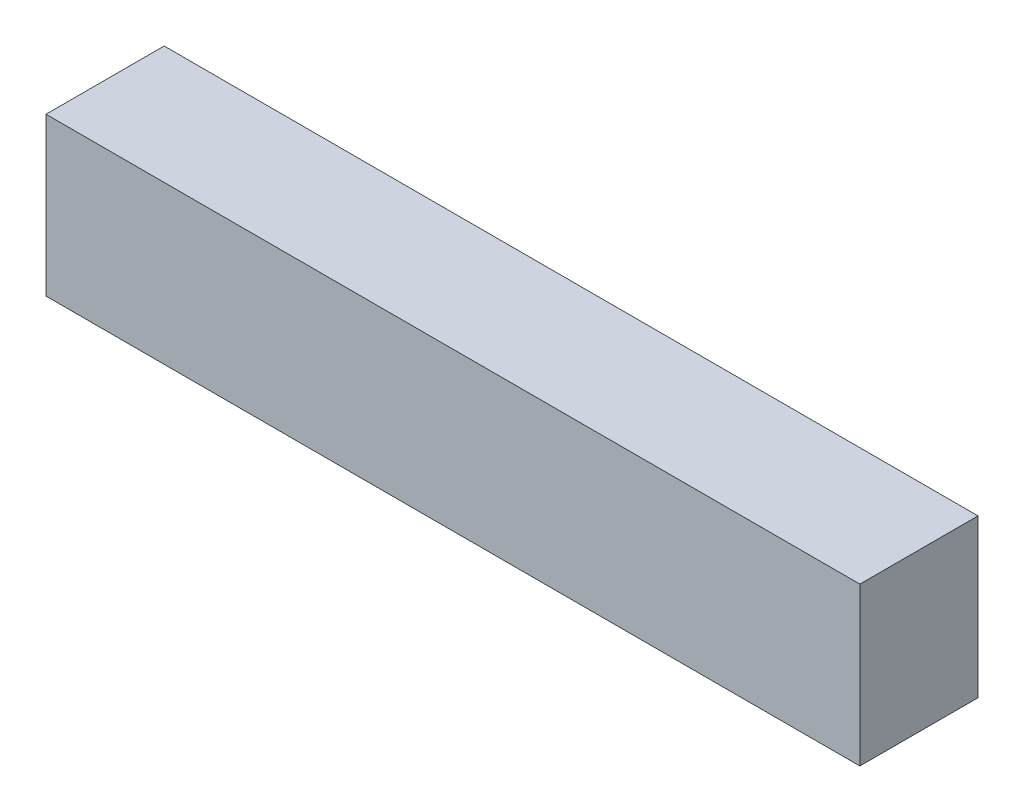
ISO-10303-21;
HEADER;
FILE_DESCRIPTION(('STEP AP214'),'2;1');
FILE_NAME('part.step','',(''),(''),'','','');
FILE_SCHEMA(('AUTOMOTIVE_DESIGN { 1 0 10303 214 1 1 1 1 }'));
ENDSEC;
DATA;
#1=APPLICATION_CONTEXT('core data for automotive mechanical design processes');
#2=APPLICATION_PROTOCOL_DEFINITION('international standard','automotive_design',2000,#1);
#3=PRODUCT_CONTEXT('',#1,'mechanical');
#4=PRODUCT('Part','Part','',(#3));
#5=PRODUCT_RELATED_PRODUCT_CATEGORY('part','',(#4));
#6=PRODUCT_DEFINITION_FORMATION('','',#4);
#7=PRODUCT_DEFINITION_CONTEXT('part definition',#1,'design');
#8=PRODUCT_DEFINITION('design','',#6,#7);
#9=PRODUCT_DEFINITION_SHAPE('','',#8);
#10=(LENGTH_UNIT() NAMED_UNIT(*) SI_UNIT(.MILLI.,.METRE.));
#11=(NAMED_UNIT(*) PLANE_ANGLE_UNIT() SI_UNIT($,.RADIAN.));
#12=(NAMED_UNIT(*) SI_UNIT($,.STERADIAN.) SOLID_ANGLE_UNIT());
#13=UNCERTAINTY_MEASURE_WITH_UNIT(LENGTH_MEASURE(1.E-05),#10,'distance_accuracy_value','');
#14=(GEOMETRIC_REPRESENTATION_CONTEXT(3) GLOBAL_UNCERTAINTY_ASSIGNED_CONTEXT((#13)) GLOBAL_UNIT_ASSIGNED_CONTEXT((#10,
#11,#12)) REPRESENTATION_CONTEXT('',''));
#15=CARTESIAN_POINT('',(0.,0.,0.));
#16=DIRECTION('',(0.,0.,1.));
#17=DIRECTION('',(1.,0.,0.));
#18=AXIS2_PLACEMENT_3D('',#15,#16,#17);
#19=CARTESIAN_POINT('',(22000.,0.,0.));
#20=DIRECTION('',(0.,0.,1.));
#21=DIRECTION('',(1.,0.,0.));
#22=AXIS2_PLACEMENT_3D('',#19,#20,#21);
#23=PLANE('',#22);
#24=DIRECTION('',(0.,1.,0.));
#25=VECTOR('',#24,1.);
#26=CARTESIAN_POINT('',(-9000.,0.,0.));
#27=LINE('',#26,#25);
#28=CARTESIAN_POINT('',(-9000.,0.,0.));
#29=VERTEX_POINT('',#28);
#30=CARTESIAN_POINT('',(-9000.,6000.,0.));
#31=VERTEX_POINT('',#30);
#32=EDGE_CURVE('E294',#29,#31,#27,.T.);
#33=ORIENTED_EDGE('',*,*,#32,.T.);
#34=DIRECTION('',(-1.,0.,0.));
#35=VECTOR('',#34,1.);
#36=CARTESIAN_POINT('',(22000.,6000.,0.));
#37=LINE('',#36,#35);
#38=CARTESIAN_POINT('',(22000.,6000.,0.));
#39=VERTEX_POINT('',#38);
#40=EDGE_CURVE('E283',#39,#31,#37,.T.);
#41=ORIENTED_EDGE('',*,*,#40,.F.);
#42=DIRECTION('',(0.,1.,0.));
#43=VECTOR('',#42,1.);
#44=CARTESIAN_POINT('',(22000.,0.,0.));
#45=LINE('',#44,#43);
#46=CARTESIAN_POINT('',(22000.,0.,0.));
#47=VERTEX_POINT('',#46);
#48=EDGE_CURVE('E285',#47,#39,#45,.T.);
#49=ORIENTED_EDGE('',*,*,#48,.F.);
#50=DIRECTION('',(-1.,0.,0.));
#51=VECTOR('',#50,1.);
#52=CARTESIAN_POINT('',(22000.,0.,0.));
#53=LINE('',#52,#51);
#54=EDGE_CURVE('E296',#47,#29,#53,.T.);
#55=ORIENTED_EDGE('',*,*,#54,.T.);
#56=EDGE_LOOP('',(#33,#41,#49,#55));
#57=FACE_BOUND('',#56,.T.);
#58=DIRECTION('',(-1.,0.,0.));
#59=VECTOR('',#58,1.);
#60=CARTESIAN_POINT('',(300.,470.,0.));
#61=LINE('',#60,#59);
#62=CARTESIAN_POINT('',(300.000000000001,470.,0.));
#63=VERTEX_POINT('',#62);
#64=CARTESIAN_POINT('',(225.,470.,0.));
#65=VERTEX_POINT('',#64);
#66=EDGE_CURVE('E187',#63,#65,#61,.T.);
#67=ORIENTED_EDGE('',*,*,#66,.T.);
#68=DIRECTION('',(0.,1.,0.));
#69=VECTOR('',#68,1.);
#70=CARTESIAN_POINT('',(225.,470.,0.));
#71=LINE('',#70,#69);
#72=CARTESIAN_POINT('',(225.,820.,0.));
#73=VERTEX_POINT('',#72);
#74=EDGE_CURVE('E172',#65,#73,#71,.T.);
#75=ORIENTED_EDGE('',*,*,#74,.T.);
#76=DIRECTION('',(1.,0.,0.));
#77=VECTOR('',#76,1.);
#78=CARTESIAN_POINT('',(300.,820.,0.));
#79=LINE('',#78,#77);
#80=CARTESIAN_POINT('',(450.,820.,0.));
#81=VERTEX_POINT('',#80);
#82=EDGE_CURVE('E184',#73,#81,#79,.T.);
#83=ORIENTED_EDGE('',*,*,#82,.T.);
#84=DIRECTION('',(0.,1.,0.));
#85=VECTOR('',#84,1.);
#86=CARTESIAN_POINT('',(450.,450.,0.));
#87=LINE('',#86,#85);
#88=CARTESIAN_POINT('',(450.,150.,0.));
#89=VERTEX_POINT('',#88);
#90=EDGE_CURVE('E260',#89,#81,#87,.T.);
#91=ORIENTED_EDGE('',*,*,#90,.F.);
#92=DIRECTION('',(1.,0.,0.));
#93=VECTOR('',#92,1.);
#94=CARTESIAN_POINT('',(300.,150.,0.));
#95=LINE('',#94,#93);
#96=CARTESIAN_POINT('',(4400.,150.,0.));
#97=VERTEX_POINT('',#96);
#98=EDGE_CURVE('E192',#89,#97,#95,.T.);
#99=ORIENTED_EDGE('',*,*,#98,.T.);
#100=DIRECTION('',(0.,1.,0.));
#101=VECTOR('',#100,1.);
#102=CARTESIAN_POINT('',(4400.,150.,0.));
#103=LINE('',#102,#101);
#104=CARTESIAN_POINT('',(4400.,1126.953873476,0.));
#105=VERTEX_POINT('',#104);
#106=EDGE_CURVE('E195',#97,#105,#103,.T.);
#107=ORIENTED_EDGE('',*,*,#106,.T.);
#108=DIRECTION('',(-0.90630778703665,0.422618261740699,0.));
#109=VECTOR('',#108,1.);
#110=CARTESIAN_POINT('',(4400.,1126.953873476,0.));
#111=LINE('',#110,#109);
#112=CARTESIAN_POINT('',(3600.,1500.,0.));
#113=VERTEX_POINT('',#112);
#114=EDGE_CURVE('E242',#105,#113,#111,.T.);
#115=ORIENTED_EDGE('',*,*,#114,.T.);
#116=DIRECTION('',(-1.,0.,0.));
#117=VECTOR('',#116,1.);
#118=CARTESIAN_POINT('',(3600.,1500.,0.));
#119=LINE('',#118,#117);
#120=CARTESIAN_POINT('',(300.,1500.,0.));
#121=VERTEX_POINT('',#120);
#122=EDGE_CURVE('E239',#113,#121,#119,.T.);
#123=ORIENTED_EDGE('',*,*,#122,.T.);
#124=CARTESIAN_POINT('',(300.,1200.,0.));
#125=DIRECTION('',(0.,0.,1.));
#126=DIRECTION('',(1.,0.,0.));
#127=AXIS2_PLACEMENT_3D('',#124,#125,#126);
#128=CIRCLE('',#127,300.);
#129=CARTESIAN_POINT('',(0.,1200.,0.));
#130=VERTEX_POINT('',#129);
#131=EDGE_CURVE('E236',#121,#130,#128,.T.);
#132=ORIENTED_EDGE('',*,*,#131,.T.);
#133=DIRECTION('',(0.,-1.,0.));
#134=VECTOR('',#133,1.);
#135=CARTESIAN_POINT('',(0.,1200.,0.));
#136=LINE('',#135,#134);
#137=CARTESIAN_POINT('',(0.,450.,0.));
#138=VERTEX_POINT('',#137);
#139=EDGE_CURVE('E232',#130,#138,#136,.T.);
#140=ORIENTED_EDGE('',*,*,#139,.T.);
#141=CARTESIAN_POINT('',(300.,450.,0.));
#142=DIRECTION('',(0.,0.,1.));
#143=DIRECTION('',(1.,0.,0.));
#144=AXIS2_PLACEMENT_3D('',#141,#142,#143);
#145=CIRCLE('',#144,300.);
#146=CARTESIAN_POINT('',(300.,150.,0.));
#147=VERTEX_POINT('',#146);
#148=EDGE_CURVE('E235',#138,#147,#145,.T.);
#149=ORIENTED_EDGE('',*,*,#148,.T.);
#150=DIRECTION('',(0.,1.,0.));
#151=VECTOR('',#150,1.);
#152=CARTESIAN_POINT('',(300.,450.,0.));
#153=LINE('',#152,#151);
#154=EDGE_CURVE('E249',#147,#63,#153,.T.);
#155=ORIENTED_EDGE('',*,*,#154,.T.);
#156=EDGE_LOOP('',(#67,#75,#83,#91,#99,#107,#115,#123,#132,#140,#149,#155));
#157=FACE_BOUND('',#156,.T.);
#158=ADVANCED_FACE('F58',(#57,#157),#23,.F.);
#159=CARTESIAN_POINT('',(22000.,0.,4500.));
#160=DIRECTION('',(0.,0.,-1.));
#161=DIRECTION('',(-1.,0.,0.));
#162=AXIS2_PLACEMENT_3D('',#159,#160,#161);
#163=PLANE('',#162);
#164=DIRECTION('',(0.,-1.,0.));
#165=VECTOR('',#164,1.);
#166=CARTESIAN_POINT('',(-9000.,0.,4500.));
#167=LINE('',#166,#165);
#168=CARTESIAN_POINT('',(-9000.,6000.,4500.));
#169=VERTEX_POINT('',#168);
#170=CARTESIAN_POINT('',(-9000.,0.,4500.));
#171=VERTEX_POINT('',#170);
#172=EDGE_CURVE('E266',#169,#171,#167,.T.);
#173=ORIENTED_EDGE('',*,*,#172,.T.);
#174=DIRECTION('',(-1.,0.,0.));
#175=VECTOR('',#174,1.);
#176=CARTESIAN_POINT('',(22000.,0.,4500.));
#177=LINE('',#176,#175);
#178=CARTESIAN_POINT('',(22000.,0.,4500.));
#179=VERTEX_POINT('',#178);
#180=EDGE_CURVE('E293',#179,#171,#177,.T.);
#181=ORIENTED_EDGE('',*,*,#180,.F.);
#182=DIRECTION('',(0.,-1.,0.));
#183=VECTOR('',#182,1.);
#184=CARTESIAN_POINT('',(22000.,0.,4500.));
#185=LINE('',#184,#183);
#186=CARTESIAN_POINT('',(22000.,6000.,4500.));
#187=VERTEX_POINT('',#186);
#188=EDGE_CURVE('E279',#187,#179,#185,.T.);
#189=ORIENTED_EDGE('',*,*,#188,.F.);
#190=DIRECTION('',(-1.,0.,0.));
#191=VECTOR('',#190,1.);
#192=CARTESIAN_POINT('',(22000.,6000.,4500.));
#193=LINE('',#192,#191);
#194=EDGE_CURVE('E290',#187,#169,#193,.T.);
#195=ORIENTED_EDGE('',*,*,#194,.T.);
#196=EDGE_LOOP('',(#173,#181,#189,#195));
#197=FACE_BOUND('',#196,.T.);
#198=ADVANCED_FACE('F313',(#197),#163,.F.);
#199=CARTESIAN_POINT('',(22000.,0.,0.));
#200=DIRECTION('',(0.,1.,0.));
#201=DIRECTION('',(0.,0.,1.));
#202=AXIS2_PLACEMENT_3D('',#199,#200,#201);
#203=PLANE('',#202);
#204=DIRECTION('',(0.,0.,-1.));
#205=VECTOR('',#204,1.);
#206=CARTESIAN_POINT('',(-9000.,0.,0.));
#207=LINE('',#206,#205);
#208=EDGE_CURVE('E291',#171,#29,#207,.T.);
#209=ORIENTED_EDGE('',*,*,#208,.T.);
#210=ORIENTED_EDGE('',*,*,#54,.F.);
#211=DIRECTION('',(0.,0.,-1.));
#212=VECTOR('',#211,1.);
#213=CARTESIAN_POINT('',(22000.,0.,0.));
#214=LINE('',#213,#212);
#215=EDGE_CURVE('E282',#179,#47,#214,.T.);
#216=ORIENTED_EDGE('',*,*,#215,.F.);
#217=ORIENTED_EDGE('',*,*,#180,.T.);
#218=EDGE_LOOP('',(#209,#210,#216,#217));
#219=FACE_BOUND('',#218,.T.);
#220=ADVANCED_FACE('F308',(#219),#203,.F.);
#221=CARTESIAN_POINT('',(22000.,6000.,0.));
#222=DIRECTION('',(0.,-1.,0.));
#223=DIRECTION('',(0.,0.,-1.));
#224=AXIS2_PLACEMENT_3D('',#221,#222,#223);
#225=PLANE('',#224);
#226=DIRECTION('',(0.,0.,1.));
#227=VECTOR('',#226,1.);
#228=CARTESIAN_POINT('',(-9000.,6000.,0.));
#229=LINE('',#228,#227);
#230=EDGE_CURVE('E297',#31,#169,#229,.T.);
#231=ORIENTED_EDGE('',*,*,#230,.T.);
#232=ORIENTED_EDGE('',*,*,#194,.F.);
#233=DIRECTION('',(0.,0.,1.));
#234=VECTOR('',#233,1.);
#235=CARTESIAN_POINT('',(22000.,6000.,0.));
#236=LINE('',#235,#234);
#237=EDGE_CURVE('E263',#39,#187,#236,.T.);
#238=ORIENTED_EDGE('',*,*,#237,.F.);
#239=ORIENTED_EDGE('',*,*,#40,.T.);
#240=EDGE_LOOP('',(#231,#232,#238,#239));
#241=FACE_BOUND('',#240,.T.);
#242=ADVANCED_FACE('F324',(#241),#225,.F.);
#243=CARTESIAN_POINT('',(22000.,0.,0.));
#244=DIRECTION('',(1.,0.,0.));
#245=DIRECTION('',(0.,0.,-1.));
#246=AXIS2_PLACEMENT_3D('',#243,#244,#245);
#247=PLANE('',#246);
#248=ORIENTED_EDGE('',*,*,#188,.T.);
#249=ORIENTED_EDGE('',*,*,#215,.T.);
#250=ORIENTED_EDGE('',*,*,#48,.T.);
#251=ORIENTED_EDGE('',*,*,#237,.T.);
#252=EDGE_LOOP('',(#248,#249,#250,#251));
#253=FACE_BOUND('',#252,.T.);
#254=ADVANCED_FACE('F326',(#253),#247,.T.);
#255=CARTESIAN_POINT('',(-9000.,0.,0.));
#256=DIRECTION('',(1.,0.,0.));
#257=DIRECTION('',(0.,0.,-1.));
#258=AXIS2_PLACEMENT_3D('',#255,#256,#257);
#259=PLANE('',#258);
#260=ORIENTED_EDGE('',*,*,#172,.F.);
#261=ORIENTED_EDGE('',*,*,#230,.F.);
#262=ORIENTED_EDGE('',*,*,#32,.F.);
#263=ORIENTED_EDGE('',*,*,#208,.F.);
#264=EDGE_LOOP('',(#260,#261,#262,#263));
#265=FACE_BOUND('',#264,.T.);
#266=ADVANCED_FACE('F317',(#265),#259,.F.);
#267=CARTESIAN_POINT('',(300.,150.,900.));
#268=DIRECTION('',(0.,1.,0.));
#269=DIRECTION('',(0.,0.,1.));
#270=AXIS2_PLACEMENT_3D('',#267,#268,#269);
#271=PLANE('',#270);
#272=DIRECTION('',(-1.,0.,0.));
#273=VECTOR('',#272,1.);
#274=CARTESIAN_POINT('',(300.,150.,225.));
#275=LINE('',#274,#273);
#276=CARTESIAN_POINT('',(450.,150.,225.));
#277=VERTEX_POINT('',#276);
#278=CARTESIAN_POINT('',(300.,150.,225.));
#279=VERTEX_POINT('',#278);
#280=EDGE_CURVE('E212',#277,#279,#275,.T.);
#281=ORIENTED_EDGE('',*,*,#280,.T.);
#282=DIRECTION('',(0.,0.,-1.));
#283=VECTOR('',#282,1.);
#284=CARTESIAN_POINT('',(300.,150.,900.));
#285=LINE('',#284,#283);
#286=CARTESIAN_POINT('',(300.,150.,900.));
#287=VERTEX_POINT('',#286);
#288=EDGE_CURVE('E216',#287,#279,#285,.T.);
#289=ORIENTED_EDGE('',*,*,#288,.F.);
#290=DIRECTION('',(1.,0.,0.));
#291=VECTOR('',#290,1.);
#292=CARTESIAN_POINT('',(300.,150.,900.));
#293=LINE('',#292,#291);
#294=CARTESIAN_POINT('',(4400.,150.,900.));
#295=VERTEX_POINT('',#294);
#296=EDGE_CURVE('E206',#287,#295,#293,.T.);
#297=ORIENTED_EDGE('',*,*,#296,.T.);
#298=DIRECTION('',(0.,0.,-1.));
#299=VECTOR('',#298,1.);
#300=CARTESIAN_POINT('',(4400.,150.,900.));
#301=LINE('',#300,#299);
#302=EDGE_CURVE('E201',#295,#97,#301,.T.);
#303=ORIENTED_EDGE('',*,*,#302,.T.);
#304=ORIENTED_EDGE('',*,*,#98,.F.);
#305=DIRECTION('',(0.,0.,-1.));
#306=VECTOR('',#305,1.);
#307=CARTESIAN_POINT('',(450.,150.,900.));
#308=LINE('',#307,#306);
#309=EDGE_CURVE('E178',#277,#89,#308,.T.);
#310=ORIENTED_EDGE('',*,*,#309,.F.);
#311=EDGE_LOOP('',(#281,#289,#297,#303,#304,#310));
#312=FACE_BOUND('',#311,.T.);
#313=ADVANCED_FACE('F276',(#312),#271,.T.);
#314=CARTESIAN_POINT('',(450.,470.,-10.));
#315=DIRECTION('',(0.,1.,0.));
#316=DIRECTION('',(0.,0.,1.));
#317=AXIS2_PLACEMENT_3D('',#314,#315,#316);
#318=PLANE('',#317);
#319=DIRECTION('',(-1.,0.,0.));
#320=VECTOR('',#319,1.);
#321=CARTESIAN_POINT('',(450.,470.,225.));
#322=LINE('',#321,#320);
#323=CARTESIAN_POINT('',(300.,470.,225.));
#324=VERTEX_POINT('',#323);
#325=CARTESIAN_POINT('',(225.,470.,225.));
#326=VERTEX_POINT('',#325);
#327=EDGE_CURVE('E199',#324,#326,#322,.T.);
#328=ORIENTED_EDGE('',*,*,#327,.T.);
#329=DIRECTION('',(0.,0.,-1.));
#330=VECTOR('',#329,1.);
#331=CARTESIAN_POINT('',(225.,470.,0.));
#332=LINE('',#331,#330);
#333=EDGE_CURVE('E75',#326,#65,#332,.T.);
#334=ORIENTED_EDGE('',*,*,#333,.T.);
#335=ORIENTED_EDGE('',*,*,#66,.F.);
#336=DIRECTION('',(0.,0.,-1.));
#337=VECTOR('',#336,1.);
#338=CARTESIAN_POINT('',(300.,470.,-10.));
#339=LINE('',#338,#337);
#340=EDGE_CURVE('E12',#324,#63,#339,.T.);
#341=ORIENTED_EDGE('',*,*,#340,.F.);
#342=EDGE_LOOP('',(#328,#334,#335,#341));
#343=FACE_BOUND('',#342,.T.);
#344=ADVANCED_FACE('F424',(#343),#318,.F.);
#345=CARTESIAN_POINT('',(300.,450.,900.));
#346=DIRECTION('',(0.,0.,-1.));
#347=DIRECTION('',(-1.,0.,0.));
#348=AXIS2_PLACEMENT_3D('',#345,#346,#347);
#349=CYLINDRICAL_SURFACE('',#348,300.);
#350=ORIENTED_EDGE('',*,*,#148,.F.);
#351=DIRECTION('',(0.,0.,-1.));
#352=VECTOR('',#351,1.);
#353=CARTESIAN_POINT('',(0.,450.,900.));
#354=LINE('',#353,#352);
#355=CARTESIAN_POINT('',(0.,450.,900.));
#356=VERTEX_POINT('',#355);
#357=EDGE_CURVE('E179',#356,#138,#354,.T.);
#358=ORIENTED_EDGE('',*,*,#357,.F.);
#359=CARTESIAN_POINT('',(300.,450.,900.));
#360=DIRECTION('',(0.,0.,1.));
#361=DIRECTION('',(1.,0.,0.));
#362=AXIS2_PLACEMENT_3D('',#359,#360,#361);
#363=CIRCLE('',#362,300.);
#364=EDGE_CURVE('E204',#356,#287,#363,.T.);
#365=ORIENTED_EDGE('',*,*,#364,.T.);
#366=ORIENTED_EDGE('',*,*,#288,.T.);
#367=DIRECTION('',(0.,0.,-1.));
#368=VECTOR('',#367,1.);
#369=CARTESIAN_POINT('',(300.,150.,900.));
#370=LINE('',#369,#368);
#371=EDGE_CURVE('E254',#279,#147,#370,.T.);
#372=ORIENTED_EDGE('',*,*,#371,.T.);
#373=EDGE_LOOP('',(#350,#358,#365,#366,#372));
#374=FACE_BOUND('',#373,.T.);
#375=ADVANCED_FACE('F417',(#374),#349,.F.);
#376=CARTESIAN_POINT('',(4400.,150.,900.));
#377=DIRECTION('',(-1.,0.,0.));
#378=DIRECTION('',(0.,0.,1.));
#379=AXIS2_PLACEMENT_3D('',#376,#377,#378);
#380=PLANE('',#379);
#381=ORIENTED_EDGE('',*,*,#106,.F.);
#382=ORIENTED_EDGE('',*,*,#302,.F.);
#383=DIRECTION('',(0.,1.,0.));
#384=VECTOR('',#383,1.);
#385=CARTESIAN_POINT('',(4400.,150.,900.));
#386=LINE('',#385,#384);
#387=CARTESIAN_POINT('',(4400.,1126.953873476,900.));
#388=VERTEX_POINT('',#387);
#389=EDGE_CURVE('E221',#295,#388,#386,.T.);
#390=ORIENTED_EDGE('',*,*,#389,.T.);
#391=DIRECTION('',(0.,0.,-1.));
#392=VECTOR('',#391,1.);
#393=CARTESIAN_POINT('',(4400.,1126.953873476,900.));
#394=LINE('',#393,#392);
#395=EDGE_CURVE('E218',#388,#105,#394,.T.);
#396=ORIENTED_EDGE('',*,*,#395,.T.);
#397=EDGE_LOOP('',(#381,#382,#390,#396));
#398=FACE_BOUND('',#397,.T.);
#399=ADVANCED_FACE('F410',(#398),#380,.T.);
#400=CARTESIAN_POINT('',(4400.,1126.953873476,900.));
#401=DIRECTION('',(-0.422618261740699,-0.90630778703665,0.));
#402=DIRECTION('',(0.90630778703665,-0.422618261740699,0.));
#403=AXIS2_PLACEMENT_3D('',#400,#401,#402);
#404=PLANE('',#403);
#405=ORIENTED_EDGE('',*,*,#114,.F.);
#406=ORIENTED_EDGE('',*,*,#395,.F.);
#407=DIRECTION('',(-0.90630778703665,0.422618261740699,0.));
#408=VECTOR('',#407,1.);
#409=CARTESIAN_POINT('',(4400.,1126.953873476,900.));
#410=LINE('',#409,#408);
#411=CARTESIAN_POINT('',(3600.,1500.,900.));
#412=VERTEX_POINT('',#411);
#413=EDGE_CURVE('E220',#388,#412,#410,.T.);
#414=ORIENTED_EDGE('',*,*,#413,.T.);
#415=DIRECTION('',(0.,0.,-1.));
#416=VECTOR('',#415,1.);
#417=CARTESIAN_POINT('',(3600.,1500.,900.));
#418=LINE('',#417,#416);
#419=EDGE_CURVE('E222',#412,#113,#418,.T.);
#420=ORIENTED_EDGE('',*,*,#419,.T.);
#421=EDGE_LOOP('',(#405,#406,#414,#420));
#422=FACE_BOUND('',#421,.T.);
#423=ADVANCED_FACE('F403',(#422),#404,.T.);
#424=CARTESIAN_POINT('',(3600.,1500.,900.));
#425=DIRECTION('',(0.,-1.,0.));
#426=DIRECTION('',(0.,0.,-1.));
#427=AXIS2_PLACEMENT_3D('',#424,#425,#426);
#428=PLANE('',#427);
#429=ORIENTED_EDGE('',*,*,#122,.F.);
#430=ORIENTED_EDGE('',*,*,#419,.F.);
#431=DIRECTION('',(-1.,0.,0.));
#432=VECTOR('',#431,1.);
#433=CARTESIAN_POINT('',(3600.,1500.,900.));
#434=LINE('',#433,#432);
#435=CARTESIAN_POINT('',(300.,1500.,900.));
#436=VERTEX_POINT('',#435);
#437=EDGE_CURVE('E224',#412,#436,#434,.T.);
#438=ORIENTED_EDGE('',*,*,#437,.T.);
#439=DIRECTION('',(0.,0.,-1.));
#440=VECTOR('',#439,1.);
#441=CARTESIAN_POINT('',(300.,1500.,900.));
#442=LINE('',#441,#440);
#443=EDGE_CURVE('E225',#436,#121,#442,.T.);
#444=ORIENTED_EDGE('',*,*,#443,.T.);
#445=EDGE_LOOP('',(#429,#430,#438,#444));
#446=FACE_BOUND('',#445,.T.);
#447=ADVANCED_FACE('F396',(#446),#428,.T.);
#448=CARTESIAN_POINT('',(300.,1200.,900.));
#449=DIRECTION('',(0.,0.,-1.));
#450=DIRECTION('',(-1.,0.,0.));
#451=AXIS2_PLACEMENT_3D('',#448,#449,#450);
#452=CYLINDRICAL_SURFACE('',#451,300.);
#453=ORIENTED_EDGE('',*,*,#131,.F.);
#454=ORIENTED_EDGE('',*,*,#443,.F.);
#455=CARTESIAN_POINT('',(300.,1200.,900.));
#456=DIRECTION('',(0.,0.,1.));
#457=DIRECTION('',(1.,0.,0.));
#458=AXIS2_PLACEMENT_3D('',#455,#456,#457);
#459=CIRCLE('',#458,300.);
#460=CARTESIAN_POINT('',(0.,1200.,900.));
#461=VERTEX_POINT('',#460);
#462=EDGE_CURVE('E227',#436,#461,#459,.T.);
#463=ORIENTED_EDGE('',*,*,#462,.T.);
#464=DIRECTION('',(0.,0.,-1.));
#465=VECTOR('',#464,1.);
#466=CARTESIAN_POINT('',(0.,1200.,900.));
#467=LINE('',#466,#465);
#468=EDGE_CURVE('E228',#461,#130,#467,.T.);
#469=ORIENTED_EDGE('',*,*,#468,.T.);
#470=EDGE_LOOP('',(#453,#454,#463,#469));
#471=FACE_BOUND('',#470,.T.);
#472=ADVANCED_FACE('F389',(#471),#452,.F.);
#473=CARTESIAN_POINT('',(0.,1200.,900.));
#474=DIRECTION('',(1.,0.,0.));
#475=DIRECTION('',(0.,0.,-1.));
#476=AXIS2_PLACEMENT_3D('',#473,#474,#475);
#477=PLANE('',#476);
#478=ORIENTED_EDGE('',*,*,#139,.F.);
#479=ORIENTED_EDGE('',*,*,#468,.F.);
#480=DIRECTION('',(0.,-1.,0.));
#481=VECTOR('',#480,1.);
#482=CARTESIAN_POINT('',(0.,1200.,900.));
#483=LINE('',#482,#481);
#484=EDGE_CURVE('E230',#461,#356,#483,.T.);
#485=ORIENTED_EDGE('',*,*,#484,.T.);
#486=ORIENTED_EDGE('',*,*,#357,.T.);
#487=EDGE_LOOP('',(#478,#479,#485,#486));
#488=FACE_BOUND('',#487,.T.);
#489=ADVANCED_FACE('F382',(#488),#477,.T.);
#490=CARTESIAN_POINT('',(300.,450.,900.));
#491=DIRECTION('',(0.,0.,1.));
#492=DIRECTION('',(1.,0.,0.));
#493=AXIS2_PLACEMENT_3D('',#490,#491,#492);
#494=PLANE('',#493);
#495=ORIENTED_EDGE('',*,*,#364,.F.);
#496=ORIENTED_EDGE('',*,*,#484,.F.);
#497=ORIENTED_EDGE('',*,*,#462,.F.);
#498=ORIENTED_EDGE('',*,*,#437,.F.);
#499=ORIENTED_EDGE('',*,*,#413,.F.);
#500=ORIENTED_EDGE('',*,*,#389,.F.);
#501=ORIENTED_EDGE('',*,*,#296,.F.);
#502=EDGE_LOOP('',(#495,#496,#497,#498,#499,#500,#501));
#503=FACE_BOUND('',#502,.T.);
#504=ADVANCED_FACE('F376',(#503),#494,.F.);
#505=CARTESIAN_POINT('',(450.,820.,-10.));
#506=DIRECTION('',(0.,-1.,0.));
#507=DIRECTION('',(0.,0.,-1.));
#508=AXIS2_PLACEMENT_3D('',#505,#506,#507);
#509=PLANE('',#508);
#510=ORIENTED_EDGE('',*,*,#82,.F.);
#511=DIRECTION('',(0.,0.,1.));
#512=VECTOR('',#511,1.);
#513=CARTESIAN_POINT('',(225.,820.,0.));
#514=LINE('',#513,#512);
#515=CARTESIAN_POINT('',(225.,820.,225.));
#516=VERTEX_POINT('',#515);
#517=EDGE_CURVE('E169',#73,#516,#514,.T.);
#518=ORIENTED_EDGE('',*,*,#517,.T.);
#519=DIRECTION('',(-1.,0.,0.));
#520=VECTOR('',#519,1.);
#521=CARTESIAN_POINT('',(450.,820.,225.));
#522=LINE('',#521,#520);
#523=CARTESIAN_POINT('',(450.,820.,225.));
#524=VERTEX_POINT('',#523);
#525=EDGE_CURVE('E61',#524,#516,#522,.T.);
#526=ORIENTED_EDGE('',*,*,#525,.F.);
#527=DIRECTION('',(0.,0.,1.));
#528=VECTOR('',#527,1.);
#529=CARTESIAN_POINT('',(450.,820.,-10.));
#530=LINE('',#529,#528);
#531=EDGE_CURVE('E191',#81,#524,#530,.T.);
#532=ORIENTED_EDGE('',*,*,#531,.F.);
#533=EDGE_LOOP('',(#510,#518,#526,#532));
#534=FACE_BOUND('',#533,.T.);
#535=ADVANCED_FACE('F190',(#534),#509,.F.);
#536=CARTESIAN_POINT('',(450.,0.,0.));
#537=DIRECTION('',(1.,0.,0.));
#538=DIRECTION('',(0.,0.,-1.));
#539=AXIS2_PLACEMENT_3D('',#536,#537,#538);
#540=PLANE('',#539);
#541=ORIENTED_EDGE('',*,*,#309,.T.);
#542=ORIENTED_EDGE('',*,*,#90,.T.);
#543=ORIENTED_EDGE('',*,*,#531,.T.);
#544=DIRECTION('',(0.,-1.,0.));
#545=VECTOR('',#544,1.);
#546=CARTESIAN_POINT('',(450.,470.,225.));
#547=LINE('',#546,#545);
#548=EDGE_CURVE('E259',#524,#277,#547,.T.);
#549=ORIENTED_EDGE('',*,*,#548,.T.);
#550=EDGE_LOOP('',(#541,#542,#543,#549));
#551=FACE_BOUND('',#550,.T.);
#552=ADVANCED_FACE('F275',(#551),#540,.T.);
#553=CARTESIAN_POINT('',(450.,470.,225.));
#554=DIRECTION('',(0.,0.,-1.));
#555=DIRECTION('',(-1.,0.,0.));
#556=AXIS2_PLACEMENT_3D('',#553,#554,#555);
#557=PLANE('',#556);
#558=ORIENTED_EDGE('',*,*,#525,.T.);
#559=DIRECTION('',(0.,-1.,0.));
#560=VECTOR('',#559,1.);
#561=CARTESIAN_POINT('',(225.,470.,225.));
#562=LINE('',#561,#560);
#563=EDGE_CURVE('E173',#516,#326,#562,.T.);
#564=ORIENTED_EDGE('',*,*,#563,.T.);
#565=ORIENTED_EDGE('',*,*,#327,.F.);
#566=DIRECTION('',(0.,-1.,0.));
#567=VECTOR('',#566,1.);
#568=CARTESIAN_POINT('',(300.,100.,225.));
#569=LINE('',#568,#567);
#570=EDGE_CURVE('E67',#324,#279,#569,.T.);
#571=ORIENTED_EDGE('',*,*,#570,.T.);
#572=ORIENTED_EDGE('',*,*,#280,.F.);
#573=ORIENTED_EDGE('',*,*,#548,.F.);
#574=EDGE_LOOP('',(#558,#564,#565,#571,#572,#573));
#575=FACE_BOUND('',#574,.T.);
#576=ADVANCED_FACE('F271',(#575),#557,.F.);
#577=CARTESIAN_POINT('',(300.,0.,0.));
#578=DIRECTION('',(1.,0.,0.));
#579=DIRECTION('',(0.,0.,-1.));
#580=AXIS2_PLACEMENT_3D('',#577,#578,#579);
#581=PLANE('',#580);
#582=ORIENTED_EDGE('',*,*,#371,.F.);
#583=ORIENTED_EDGE('',*,*,#570,.F.);
#584=ORIENTED_EDGE('',*,*,#340,.T.);
#585=ORIENTED_EDGE('',*,*,#154,.F.);
#586=EDGE_LOOP('',(#582,#583,#584,#585));
#587=FACE_BOUND('',#586,.T.);
#588=ADVANCED_FACE('F351',(#587),#581,.F.);
#589=CARTESIAN_POINT('',(225.,0.,0.));
#590=DIRECTION('',(1.,0.,0.));
#591=DIRECTION('',(0.,0.,-1.));
#592=AXIS2_PLACEMENT_3D('',#589,#590,#591);
#593=PLANE('',#592);
#594=ORIENTED_EDGE('',*,*,#563,.F.);
#595=ORIENTED_EDGE('',*,*,#517,.F.);
#596=ORIENTED_EDGE('',*,*,#74,.F.);
#597=ORIENTED_EDGE('',*,*,#333,.F.);
#598=EDGE_LOOP('',(#594,#595,#596,#597));
#599=FACE_BOUND('',#598,.T.);
#600=ADVANCED_FACE('F171',(#599),#593,.F.);
#601=CLOSED_SHELL('',(#158,#198,#220,#242,#254,#266,#313,#344,#375,#399,#423,#447,#472,#489,
#504,#535,#552,#576,#588,#600));
#602=MANIFOLD_SOLID_BREP('B2',#601);
#603=CARTESIAN_POINT('',(40.,0.,0.));
#604=DIRECTION('',(1.,0.,0.));
#605=DIRECTION('',(0.,0.,-1.));
#606=AXIS2_PLACEMENT_3D('',#603,#604,#605);
#607=PLANE('',#606);
#608=DIRECTION('',(0.,1.,0.));
#609=VECTOR('',#608,1.);
#610=CARTESIAN_POINT('',(40.,450.,0.));
#611=LINE('',#610,#609);
#612=CARTESIAN_POINT('',(40.,470.,0.));
#613=VERTEX_POINT('',#612);
#614=CARTESIAN_POINT('',(40.,820.,0.));
#615=VERTEX_POINT('',#614);
#616=EDGE_CURVE('E680',#613,#615,#611,.T.);
#617=ORIENTED_EDGE('',*,*,#616,.F.);
#618=DIRECTION('',(0.,0.,-1.));
#619=VECTOR('',#618,1.);
#620=CARTESIAN_POINT('',(40.,470.,-10.));
#621=LINE('',#620,#619);
#622=CARTESIAN_POINT('',(40.,470.,225.));
#623=VERTEX_POINT('',#622);
#624=EDGE_CURVE('E694',#623,#613,#621,.T.);
#625=ORIENTED_EDGE('',*,*,#624,.F.);
#626=DIRECTION('',(0.,-1.,0.));
#627=VECTOR('',#626,1.);
#628=CARTESIAN_POINT('',(40.,470.,225.));
#629=LINE('',#628,#627);
#630=CARTESIAN_POINT('',(40.,820.,225.));
#631=VERTEX_POINT('',#630);
#632=EDGE_CURVE('E679',#631,#623,#629,.T.);
#633=ORIENTED_EDGE('',*,*,#632,.F.);
#634=DIRECTION('',(0.,0.,1.));
#635=VECTOR('',#634,1.);
#636=CARTESIAN_POINT('',(40.,820.,-10.));
#637=LINE('',#636,#635);
#638=EDGE_CURVE('E684',#615,#631,#637,.T.);
#639=ORIENTED_EDGE('',*,*,#638,.F.);
#640=EDGE_LOOP('',(#617,#625,#633,#639));
#641=FACE_BOUND('',#640,.T.);
#642=ADVANCED_FACE('F624',(#641),#607,.F.);
#643=CARTESIAN_POINT('',(450.,470.,225.));
#644=DIRECTION('',(0.,0.,-1.));
#645=DIRECTION('',(-1.,0.,0.));
#646=AXIS2_PLACEMENT_3D('',#643,#644,#645);
#647=PLANE('',#646);
#648=DIRECTION('',(0.,-1.,0.));
#649=VECTOR('',#648,1.);
#650=CARTESIAN_POINT('',(200.,470.,225.));
#651=LINE('',#650,#649);
#652=CARTESIAN_POINT('',(200.,820.,225.));
#653=VERTEX_POINT('',#652);
#654=CARTESIAN_POINT('',(200.,470.,225.));
#655=VERTEX_POINT('',#654);
#656=EDGE_CURVE('E662',#653,#655,#651,.T.);
#657=ORIENTED_EDGE('',*,*,#656,.F.);
#658=DIRECTION('',(-1.,0.,0.));
#659=VECTOR('',#658,1.);
#660=CARTESIAN_POINT('',(450.,820.,225.));
#661=LINE('',#660,#659);
#662=EDGE_CURVE('E681',#653,#631,#661,.T.);
#663=ORIENTED_EDGE('',*,*,#662,.T.);
#664=ORIENTED_EDGE('',*,*,#632,.T.);
#665=DIRECTION('',(-1.,0.,0.));
#666=VECTOR('',#665,1.);
#667=CARTESIAN_POINT('',(450.,470.,225.));
#668=LINE('',#667,#666);
#669=EDGE_CURVE('E672',#655,#623,#668,.T.);
#670=ORIENTED_EDGE('',*,*,#669,.F.);
#671=EDGE_LOOP('',(#657,#663,#664,#670));
#672=FACE_BOUND('',#671,.T.);
#673=ADVANCED_FACE('F677',(#672),#647,.F.);
#674=CARTESIAN_POINT('',(450.,820.,-10.));
#675=DIRECTION('',(0.,-1.,0.));
#676=DIRECTION('',(0.,0.,-1.));
#677=AXIS2_PLACEMENT_3D('',#674,#675,#676);
#678=PLANE('',#677);
#679=DIRECTION('',(0.,0.,1.));
#680=VECTOR('',#679,1.);
#681=CARTESIAN_POINT('',(200.,820.,0.));
#682=LINE('',#681,#680);
#683=CARTESIAN_POINT('',(200.,820.,0.));
#684=VERTEX_POINT('',#683);
#685=EDGE_CURVE('E639',#684,#653,#682,.T.);
#686=ORIENTED_EDGE('',*,*,#685,.F.);
#687=DIRECTION('',(1.,0.,0.));
#688=VECTOR('',#687,1.);
#689=CARTESIAN_POINT('',(300.,820.,0.));
#690=LINE('',#689,#688);
#691=EDGE_CURVE('E632',#615,#684,#690,.T.);
#692=ORIENTED_EDGE('',*,*,#691,.F.);
#693=ORIENTED_EDGE('',*,*,#638,.T.);
#694=ORIENTED_EDGE('',*,*,#662,.F.);
#695=EDGE_LOOP('',(#686,#692,#693,#694));
#696=FACE_BOUND('',#695,.T.);
#697=ADVANCED_FACE('F692',(#696),#678,.F.);
#698=CARTESIAN_POINT('',(450.,470.,-10.));
#699=DIRECTION('',(0.,1.,0.));
#700=DIRECTION('',(0.,0.,1.));
#701=AXIS2_PLACEMENT_3D('',#698,#699,#700);
#702=PLANE('',#701);
#703=DIRECTION('',(0.,0.,-1.));
#704=VECTOR('',#703,1.);
#705=CARTESIAN_POINT('',(200.,470.,0.));
#706=LINE('',#705,#704);
#707=CARTESIAN_POINT('',(200.,470.,0.));
#708=VERTEX_POINT('',#707);
#709=EDGE_CURVE('E665',#655,#708,#706,.T.);
#710=ORIENTED_EDGE('',*,*,#709,.F.);
#711=ORIENTED_EDGE('',*,*,#669,.T.);
#712=ORIENTED_EDGE('',*,*,#624,.T.);
#713=DIRECTION('',(-1.,0.,0.));
#714=VECTOR('',#713,1.);
#715=CARTESIAN_POINT('',(300.,470.,0.));
#716=LINE('',#715,#714);
#717=EDGE_CURVE('E56',#708,#613,#716,.T.);
#718=ORIENTED_EDGE('',*,*,#717,.F.);
#719=EDGE_LOOP('',(#710,#711,#712,#718));
#720=FACE_BOUND('',#719,.T.);
#721=ADVANCED_FACE('F671',(#720),#702,.F.);
#722=CARTESIAN_POINT('',(22000.,0.,0.));
#723=DIRECTION('',(0.,0.,1.));
#724=DIRECTION('',(1.,0.,0.));
#725=AXIS2_PLACEMENT_3D('',#722,#723,#724);
#726=PLANE('',#725);
#727=DIRECTION('',(0.,1.,0.));
#728=VECTOR('',#727,1.);
#729=CARTESIAN_POINT('',(200.,470.,0.));
#730=LINE('',#729,#728);
#731=EDGE_CURVE('E674',#708,#684,#730,.T.);
#732=ORIENTED_EDGE('',*,*,#731,.F.);
#733=ORIENTED_EDGE('',*,*,#717,.T.);
#734=ORIENTED_EDGE('',*,*,#616,.T.);
#735=ORIENTED_EDGE('',*,*,#691,.T.);
#736=EDGE_LOOP('',(#732,#733,#734,#735));
#737=FACE_BOUND('',#736,.T.);
#738=ADVANCED_FACE('F626',(#737),#726,.F.);
#739=CARTESIAN_POINT('',(200.,0.,0.));
#740=DIRECTION('',(1.,0.,0.));
#741=DIRECTION('',(0.,0.,-1.));
#742=AXIS2_PLACEMENT_3D('',#739,#740,#741);
#743=PLANE('',#742);
#744=ORIENTED_EDGE('',*,*,#656,.T.);
#745=ORIENTED_EDGE('',*,*,#709,.T.);
#746=ORIENTED_EDGE('',*,*,#731,.T.);
#747=ORIENTED_EDGE('',*,*,#685,.T.);
#748=EDGE_LOOP('',(#744,#745,#746,#747));
#749=FACE_BOUND('',#748,.T.);
#750=ADVANCED_FACE('F664',(#749),#743,.T.);
#751=CLOSED_SHELL('',(#642,#673,#697,#721,#738,#750));
#752=MANIFOLD_SOLID_BREP('B6',#751);
#753=CARTESIAN_POINT('',(225.,470.,225.));
#754=DIRECTION('',(0.,0.,-1.));
#755=DIRECTION('',(-1.,0.,0.));
#756=AXIS2_PLACEMENT_3D('',#753,#754,#755);
#757=PLANE('',#756);
#758=DIRECTION('',(0.,-1.,0.));
#759=VECTOR('',#758,1.);
#760=CARTESIAN_POINT('',(200.,470.,225.));
#761=LINE('',#760,#759);
#762=CARTESIAN_POINT('',(200.,820.,225.));
#763=VERTEX_POINT('',#762);
#764=CARTESIAN_POINT('',(200.,470.,225.));
#765=VERTEX_POINT('',#764);
#766=EDGE_CURVE('E852',#763,#765,#761,.T.);
#767=ORIENTED_EDGE('',*,*,#766,.T.);
#768=DIRECTION('',(-1.,0.,0.));
#769=VECTOR('',#768,1.);
#770=CARTESIAN_POINT('',(225.,470.,225.));
#771=LINE('',#770,#769);
#772=CARTESIAN_POINT('',(225.,470.,225.));
#773=VERTEX_POINT('',#772);
#774=EDGE_CURVE('E622',#773,#765,#771,.T.);
#775=ORIENTED_EDGE('',*,*,#774,.F.);
#776=DIRECTION('',(0.,-1.,0.));
#777=VECTOR('',#776,1.);
#778=CARTESIAN_POINT('',(225.,470.,225.));
#779=LINE('',#778,#777);
#780=CARTESIAN_POINT('',(225.,820.,225.));
#781=VERTEX_POINT('',#780);
#782=EDGE_CURVE('E840',#781,#773,#779,.T.);
#783=ORIENTED_EDGE('',*,*,#782,.F.);
#784=DIRECTION('',(-1.,0.,0.));
#785=VECTOR('',#784,1.);
#786=CARTESIAN_POINT('',(225.,820.,225.));
#787=LINE('',#786,#785);
#788=EDGE_CURVE('E848',#781,#763,#787,.T.);
#789=ORIENTED_EDGE('',*,*,#788,.T.);
#790=EDGE_LOOP('',(#767,#775,#783,#789));
#791=FACE_BOUND('',#790,.T.);
#792=ADVANCED_FACE('F789',(#791),#757,.F.);
#793=CARTESIAN_POINT('',(225.,470.,0.));
#794=DIRECTION('',(0.,1.,0.));
#795=DIRECTION('',(0.,0.,1.));
#796=AXIS2_PLACEMENT_3D('',#793,#794,#795);
#797=PLANE('',#796);
#798=DIRECTION('',(0.,0.,-1.));
#799=VECTOR('',#798,1.);
#800=CARTESIAN_POINT('',(200.,470.,0.));
#801=LINE('',#800,#799);
#802=CARTESIAN_POINT('',(200.,470.,0.));
#803=VERTEX_POINT('',#802);
#804=EDGE_CURVE('E844',#765,#803,#801,.T.);
#805=ORIENTED_EDGE('',*,*,#804,.T.);
#806=DIRECTION('',(-1.,0.,0.));
#807=VECTOR('',#806,1.);
#808=CARTESIAN_POINT('',(225.,470.,0.));
#809=LINE('',#808,#807);
#810=CARTESIAN_POINT('',(225.,470.,0.));
#811=VERTEX_POINT('',#810);
#812=EDGE_CURVE('E797',#811,#803,#809,.T.);
#813=ORIENTED_EDGE('',*,*,#812,.F.);
#814=DIRECTION('',(0.,0.,-1.));
#815=VECTOR('',#814,1.);
#816=CARTESIAN_POINT('',(225.,470.,0.));
#817=LINE('',#816,#815);
#818=EDGE_CURVE('E835',#773,#811,#817,.T.);
#819=ORIENTED_EDGE('',*,*,#818,.F.);
#820=ORIENTED_EDGE('',*,*,#774,.T.);
#821=EDGE_LOOP('',(#805,#813,#819,#820));
#822=FACE_BOUND('',#821,.T.);
#823=ADVANCED_FACE('F843',(#822),#797,.F.);
#824=CARTESIAN_POINT('',(225.,470.,0.));
#825=DIRECTION('',(0.,0.,1.));
#826=DIRECTION('',(1.,0.,0.));
#827=AXIS2_PLACEMENT_3D('',#824,#825,#826);
#828=PLANE('',#827);
#829=DIRECTION('',(0.,1.,0.));
#830=VECTOR('',#829,1.);
#831=CARTESIAN_POINT('',(200.,470.,0.));
#832=LINE('',#831,#830);
#833=CARTESIAN_POINT('',(200.,820.,0.));
#834=VERTEX_POINT('',#833);
#835=EDGE_CURVE('E822',#803,#834,#832,.T.);
#836=ORIENTED_EDGE('',*,*,#835,.T.);
#837=DIRECTION('',(-1.,0.,0.));
#838=VECTOR('',#837,1.);
#839=CARTESIAN_POINT('',(225.,820.,0.));
#840=LINE('',#839,#838);
#841=CARTESIAN_POINT('',(225.,820.,0.));
#842=VERTEX_POINT('',#841);
#843=EDGE_CURVE('E845',#842,#834,#840,.T.);
#844=ORIENTED_EDGE('',*,*,#843,.F.);
#845=DIRECTION('',(0.,1.,0.));
#846=VECTOR('',#845,1.);
#847=CARTESIAN_POINT('',(225.,470.,0.));
#848=LINE('',#847,#846);
#849=EDGE_CURVE('E838',#811,#842,#848,.T.);
#850=ORIENTED_EDGE('',*,*,#849,.F.);
#851=ORIENTED_EDGE('',*,*,#812,.T.);
#852=EDGE_LOOP('',(#836,#844,#850,#851));
#853=FACE_BOUND('',#852,.T.);
#854=ADVANCED_FACE('F846',(#853),#828,.F.);
#855=CARTESIAN_POINT('',(225.,820.,0.));
#856=DIRECTION('',(0.,-1.,0.));
#857=DIRECTION('',(0.,0.,-1.));
#858=AXIS2_PLACEMENT_3D('',#855,#856,#857);
#859=PLANE('',#858);
#860=DIRECTION('',(0.,0.,1.));
#861=VECTOR('',#860,1.);
#862=CARTESIAN_POINT('',(200.,820.,0.));
#863=LINE('',#862,#861);
#864=EDGE_CURVE('E828',#834,#763,#863,.T.);
#865=ORIENTED_EDGE('',*,*,#864,.T.);
#866=ORIENTED_EDGE('',*,*,#788,.F.);
#867=DIRECTION('',(0.,0.,1.));
#868=VECTOR('',#867,1.);
#869=CARTESIAN_POINT('',(225.,820.,0.));
#870=LINE('',#869,#868);
#871=EDGE_CURVE('E805',#842,#781,#870,.T.);
#872=ORIENTED_EDGE('',*,*,#871,.F.);
#873=ORIENTED_EDGE('',*,*,#843,.T.);
#874=EDGE_LOOP('',(#865,#866,#872,#873));
#875=FACE_BOUND('',#874,.T.);
#876=ADVANCED_FACE('F859',(#875),#859,.F.);
#877=CARTESIAN_POINT('',(225.,0.,0.));
#878=DIRECTION('',(1.,0.,0.));
#879=DIRECTION('',(0.,0.,-1.));
#880=AXIS2_PLACEMENT_3D('',#877,#878,#879);
#881=PLANE('',#880);
#882=ORIENTED_EDGE('',*,*,#782,.T.);
#883=ORIENTED_EDGE('',*,*,#818,.T.);
#884=ORIENTED_EDGE('',*,*,#849,.T.);
#885=ORIENTED_EDGE('',*,*,#871,.T.);
#886=EDGE_LOOP('',(#882,#883,#884,#885));
#887=FACE_BOUND('',#886,.T.);
#888=ADVANCED_FACE('F836',(#887),#881,.T.);
#889=CARTESIAN_POINT('',(200.,0.,0.));
#890=DIRECTION('',(1.,0.,0.));
#891=DIRECTION('',(0.,0.,-1.));
#892=AXIS2_PLACEMENT_3D('',#889,#890,#891);
#893=PLANE('',#892);
#894=ORIENTED_EDGE('',*,*,#766,.F.);
#895=ORIENTED_EDGE('',*,*,#864,.F.);
#896=ORIENTED_EDGE('',*,*,#835,.F.);
#897=ORIENTED_EDGE('',*,*,#804,.F.);
#898=EDGE_LOOP('',(#894,#895,#896,#897));
#899=FACE_BOUND('',#898,.T.);
#900=ADVANCED_FACE('F862',(#899),#893,.F.);
#901=CLOSED_SHELL('',(#792,#823,#854,#876,#888,#900));
#902=MANIFOLD_SOLID_BREP('B50',#901);
#903=ADVANCED_BREP_SHAPE_REPRESENTATION('',(#18,#602,#752,#902),#14);
#904=SHAPE_DEFINITION_REPRESENTATION(#9,#903);
ENDSEC;
END-ISO-10303-21;
